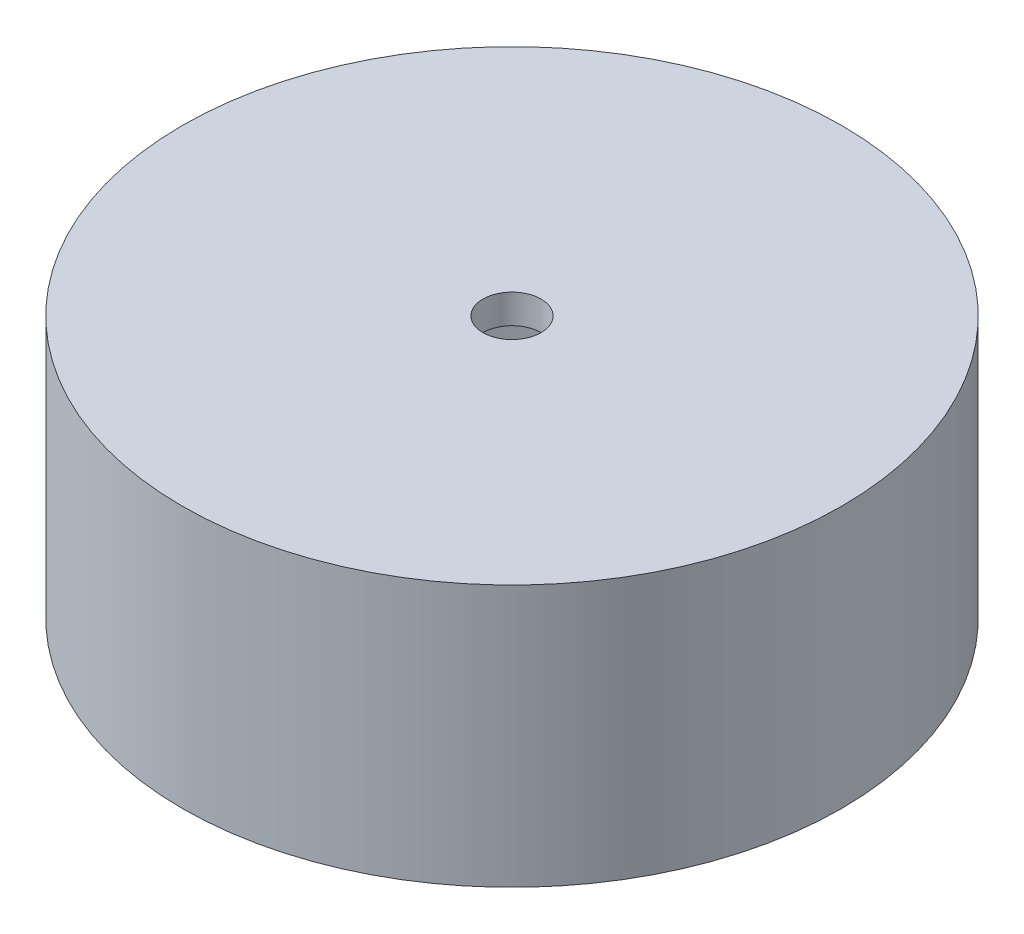
ISO-10303-21;
HEADER;
FILE_DESCRIPTION(('STEP AP214'),'2;1');
FILE_NAME('part.step','',(''),(''),'','','');
FILE_SCHEMA(('AUTOMOTIVE_DESIGN { 1 0 10303 214 1 1 1 1 }'));
ENDSEC;
DATA;
#1=APPLICATION_CONTEXT('core data for automotive mechanical design processes');
#2=APPLICATION_PROTOCOL_DEFINITION('international standard','automotive_design',2000,#1);
#3=PRODUCT_CONTEXT('',#1,'mechanical');
#4=PRODUCT('Part','Part','',(#3));
#5=PRODUCT_RELATED_PRODUCT_CATEGORY('part','',(#4));
#6=PRODUCT_DEFINITION_FORMATION('','',#4);
#7=PRODUCT_DEFINITION_CONTEXT('part definition',#1,'design');
#8=PRODUCT_DEFINITION('design','',#6,#7);
#9=PRODUCT_DEFINITION_SHAPE('','',#8);
#10=(LENGTH_UNIT() NAMED_UNIT(*) SI_UNIT(.MILLI.,.METRE.));
#11=(NAMED_UNIT(*) PLANE_ANGLE_UNIT() SI_UNIT($,.RADIAN.));
#12=(NAMED_UNIT(*) SI_UNIT($,.STERADIAN.) SOLID_ANGLE_UNIT());
#13=UNCERTAINTY_MEASURE_WITH_UNIT(LENGTH_MEASURE(1.E-05),#10,'distance_accuracy_value','');
#14=(GEOMETRIC_REPRESENTATION_CONTEXT(3) GLOBAL_UNCERTAINTY_ASSIGNED_CONTEXT((#13)) GLOBAL_UNIT_ASSIGNED_CONTEXT((#10,
#11,#12)) REPRESENTATION_CONTEXT('',''));
#15=CARTESIAN_POINT('',(0.,0.,0.));
#16=DIRECTION('',(0.,0.,1.));
#17=DIRECTION('',(1.,0.,0.));
#18=AXIS2_PLACEMENT_3D('',#15,#16,#17);
#19=CARTESIAN_POINT('',(0.,0.,0.));
#20=DIRECTION('',(0.,1.,0.));
#21=DIRECTION('',(0.,0.,1.));
#22=AXIS2_PLACEMENT_3D('',#19,#20,#21);
#23=PLANE('',#22);
#24=CARTESIAN_POINT('',(0.,0.,0.));
#25=DIRECTION('',(0.,1.,0.));
#26=DIRECTION('',(0.,0.,1.));
#27=AXIS2_PLACEMENT_3D('',#24,#25,#26);
#28=CIRCLE('',#27,7.5);
#29=CARTESIAN_POINT('',(0.,0.,7.5));
#30=VERTEX_POINT('',#29);
#31=EDGE_CURVE('E51',#30,#30,#28,.T.);
#32=ORIENTED_EDGE('',*,*,#31,.T.);
#33=EDGE_LOOP('',(#32));
#34=FACE_BOUND('',#33,.T.);
#35=CARTESIAN_POINT('',(0.,0.,0.));
#36=DIRECTION('',(0.,1.,0.));
#37=DIRECTION('',(0.,0.,1.));
#38=AXIS2_PLACEMENT_3D('',#35,#36,#37);
#39=CIRCLE('',#38,8.5);
#40=CARTESIAN_POINT('',(0.,0.,8.5));
#41=VERTEX_POINT('',#40);
#42=EDGE_CURVE('E57',#41,#41,#39,.T.);
#43=ORIENTED_EDGE('',*,*,#42,.F.);
#44=EDGE_LOOP('',(#43));
#45=FACE_BOUND('',#44,.T.);
#46=ADVANCED_FACE('F43',(#34,#45),#23,.F.);
#47=CARTESIAN_POINT('',(0.,6.,0.));
#48=DIRECTION('',(0.,-1.,0.));
#49=DIRECTION('',(0.,0.,-1.));
#50=AXIS2_PLACEMENT_3D('',#47,#48,#49);
#51=CYLINDRICAL_SURFACE('',#50,8.5);
#52=ORIENTED_EDGE('',*,*,#42,.T.);
#53=EDGE_LOOP('',(#52));
#54=FACE_BOUND('',#53,.T.);
#55=CARTESIAN_POINT('',(0.,6.75,0.));
#56=DIRECTION('',(0.,1.,0.));
#57=DIRECTION('',(0.,0.,1.));
#58=AXIS2_PLACEMENT_3D('',#55,#56,#57);
#59=CIRCLE('',#58,8.5);
#60=CARTESIAN_POINT('',(0.,6.75,8.5));
#61=VERTEX_POINT('',#60);
#62=EDGE_CURVE('E99',#61,#61,#59,.T.);
#63=ORIENTED_EDGE('',*,*,#62,.F.);
#64=EDGE_LOOP('',(#63));
#65=FACE_BOUND('',#64,.T.);
#66=ADVANCED_FACE('F89',(#54,#65),#51,.T.);
#67=CARTESIAN_POINT('',(0.,6.,0.));
#68=DIRECTION('',(0.,-1.,0.));
#69=DIRECTION('',(0.,0.,-1.));
#70=AXIS2_PLACEMENT_3D('',#67,#68,#69);
#71=CYLINDRICAL_SURFACE('',#70,7.);
#72=CARTESIAN_POINT('',(0.,0.5,0.));
#73=DIRECTION('',(0.,1.,0.));
#74=DIRECTION('',(0.,0.,1.));
#75=AXIS2_PLACEMENT_3D('',#72,#73,#74);
#76=CIRCLE('',#75,7.);
#77=CARTESIAN_POINT('',(0.,0.5,7.));
#78=VERTEX_POINT('',#77);
#79=EDGE_CURVE('E10',#78,#78,#76,.F.);
#80=ORIENTED_EDGE('',*,*,#79,.T.);
#81=EDGE_LOOP('',(#80));
#82=FACE_BOUND('',#81,.T.);
#83=CARTESIAN_POINT('',(0.,6.,0.));
#84=DIRECTION('',(0.,1.,0.));
#85=DIRECTION('',(0.,0.,1.));
#86=AXIS2_PLACEMENT_3D('',#83,#84,#85);
#87=CIRCLE('',#86,7.);
#88=CARTESIAN_POINT('',(0.,6.,7.));
#89=VERTEX_POINT('',#88);
#90=EDGE_CURVE('E61',#89,#89,#87,.T.);
#91=ORIENTED_EDGE('',*,*,#90,.T.);
#92=EDGE_LOOP('',(#91));
#93=FACE_BOUND('',#92,.T.);
#94=ADVANCED_FACE('F88',(#82,#93),#71,.F.);
#95=CARTESIAN_POINT('',(0.,6.,0.));
#96=DIRECTION('',(0.,1.,0.));
#97=DIRECTION('',(0.,0.,1.));
#98=AXIS2_PLACEMENT_3D('',#95,#96,#97);
#99=PLANE('',#98);
#100=CARTESIAN_POINT('',(0.,6.,0.));
#101=DIRECTION('',(0.,1.,0.));
#102=DIRECTION('',(0.,0.,1.));
#103=AXIS2_PLACEMENT_3D('',#100,#101,#102);
#104=CIRCLE('',#103,0.75);
#105=CARTESIAN_POINT('',(0.,6.,0.75));
#106=VERTEX_POINT('',#105);
#107=EDGE_CURVE('E103',#106,#106,#104,.T.);
#108=ORIENTED_EDGE('',*,*,#107,.T.);
#109=EDGE_LOOP('',(#108));
#110=FACE_BOUND('',#109,.T.);
#111=ORIENTED_EDGE('',*,*,#90,.F.);
#112=EDGE_LOOP('',(#111));
#113=FACE_BOUND('',#112,.T.);
#114=ADVANCED_FACE('F83',(#110,#113),#99,.F.);
#115=CARTESIAN_POINT('',(0.,6.75,0.));
#116=DIRECTION('',(0.,1.,0.));
#117=DIRECTION('',(0.,0.,1.));
#118=AXIS2_PLACEMENT_3D('',#115,#116,#117);
#119=PLANE('',#118);
#120=CARTESIAN_POINT('',(0.,6.750012,0.));
#121=DIRECTION('',(0.,1.,0.));
#122=DIRECTION('',(0.,0.,1.));
#123=AXIS2_PLACEMENT_3D('',#120,#121,#122);
#124=CIRCLE('',#123,0.75);
#125=CARTESIAN_POINT('',(0.,6.750012,0.75));
#126=VERTEX_POINT('',#125);
#127=EDGE_CURVE('E109',#126,#126,#124,.T.);
#128=ORIENTED_EDGE('',*,*,#127,.F.);
#129=EDGE_LOOP('',(#128));
#130=FACE_BOUND('',#129,.T.);
#131=ORIENTED_EDGE('',*,*,#62,.T.);
#132=EDGE_LOOP('',(#131));
#133=FACE_BOUND('',#132,.T.);
#134=ADVANCED_FACE('F69',(#130,#133),#119,.T.);
#135=CARTESIAN_POINT('',(0.,0.,0.));
#136=DIRECTION('',(0.,1.,0.));
#137=DIRECTION('',(0.,0.,1.));
#138=AXIS2_PLACEMENT_3D('',#135,#136,#137);
#139=CYLINDRICAL_SURFACE('',#138,0.75);
#140=ORIENTED_EDGE('',*,*,#127,.T.);
#141=EDGE_LOOP('',(#140));
#142=FACE_BOUND('',#141,.T.);
#143=ORIENTED_EDGE('',*,*,#107,.F.);
#144=EDGE_LOOP('',(#143));
#145=FACE_BOUND('',#144,.T.);
#146=ADVANCED_FACE('F80',(#142,#145),#139,.F.);
#147=CARTESIAN_POINT('',(0.,0.5,0.));
#148=DIRECTION('',(0.,1.,0.));
#149=DIRECTION('',(0.,0.,1.));
#150=AXIS2_PLACEMENT_3D('',#147,#148,#149);
#151=TOROIDAL_SURFACE('',#150,7.5,0.5);
#152=ORIENTED_EDGE('',*,*,#79,.F.);
#153=EDGE_LOOP('',(#152));
#154=FACE_BOUND('',#153,.T.);
#155=ORIENTED_EDGE('',*,*,#31,.F.);
#156=EDGE_LOOP('',(#155));
#157=FACE_BOUND('',#156,.T.);
#158=ADVANCED_FACE('F44',(#154,#157),#151,.T.);
#159=CLOSED_SHELL('',(#46,#66,#94,#114,#134,#146,#158));
#160=MANIFOLD_SOLID_BREP('B2',#159);
#161=ADVANCED_BREP_SHAPE_REPRESENTATION('',(#18,#160),#14);
#162=SHAPE_DEFINITION_REPRESENTATION(#9,#161);
ENDSEC;
END-ISO-10303-21;
